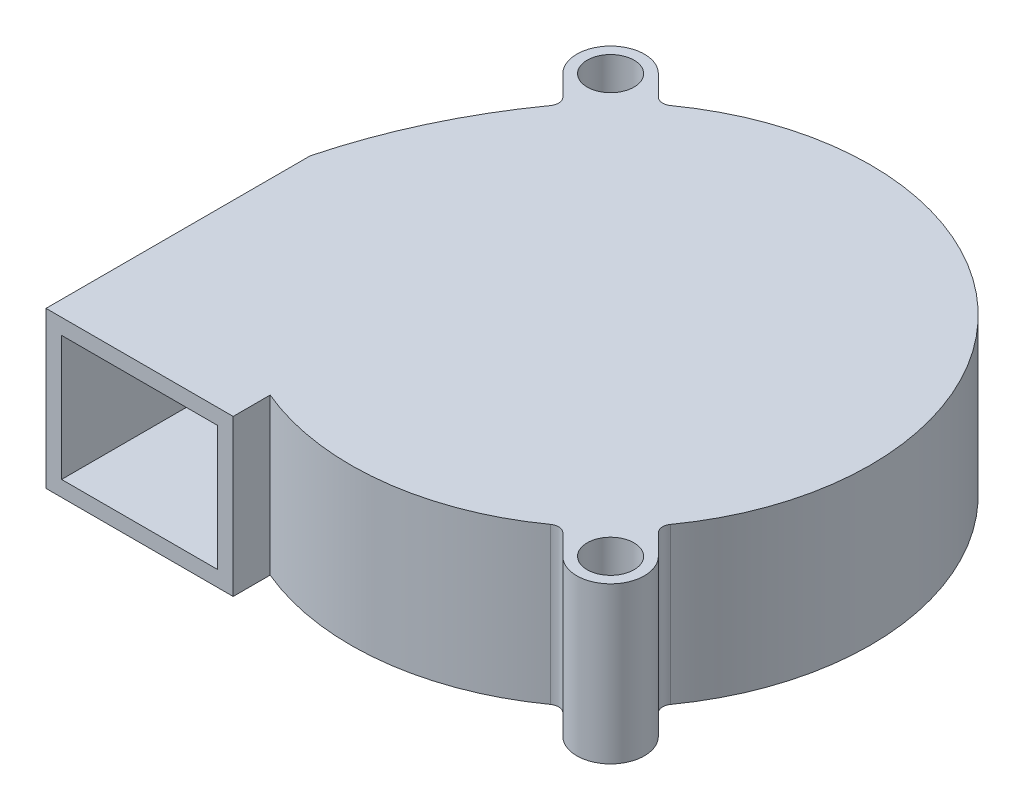
ISO-10303-21;
HEADER;
FILE_DESCRIPTION(('STEP AP214'),'2;1');
FILE_NAME('part.step','',(''),(''),'','','');
FILE_SCHEMA(('AUTOMOTIVE_DESIGN { 1 0 10303 214 1 1 1 1 }'));
ENDSEC;
DATA;
#1=APPLICATION_CONTEXT('core data for automotive mechanical design processes');
#2=APPLICATION_PROTOCOL_DEFINITION('international standard','automotive_design',2000,#1);
#3=PRODUCT_CONTEXT('',#1,'mechanical');
#4=PRODUCT('Part','Part','',(#3));
#5=PRODUCT_RELATED_PRODUCT_CATEGORY('part','',(#4));
#6=PRODUCT_DEFINITION_FORMATION('','',#4);
#7=PRODUCT_DEFINITION_CONTEXT('part definition',#1,'design');
#8=PRODUCT_DEFINITION('design','',#6,#7);
#9=PRODUCT_DEFINITION_SHAPE('','',#8);
#10=(LENGTH_UNIT() NAMED_UNIT(*) SI_UNIT(.MILLI.,.METRE.));
#11=(NAMED_UNIT(*) PLANE_ANGLE_UNIT() SI_UNIT($,.RADIAN.));
#12=(NAMED_UNIT(*) SI_UNIT($,.STERADIAN.) SOLID_ANGLE_UNIT());
#13=UNCERTAINTY_MEASURE_WITH_UNIT(LENGTH_MEASURE(1.E-05),#10,'distance_accuracy_value','');
#14=(GEOMETRIC_REPRESENTATION_CONTEXT(3) GLOBAL_UNCERTAINTY_ASSIGNED_CONTEXT((#13)) GLOBAL_UNIT_ASSIGNED_CONTEXT((#10,
#11,#12)) REPRESENTATION_CONTEXT('',''));
#15=CARTESIAN_POINT('',(0.,0.,0.));
#16=DIRECTION('',(0.,0.,1.));
#17=DIRECTION('',(1.,0.,0.));
#18=AXIS2_PLACEMENT_3D('',#15,#16,#17);
#19=CARTESIAN_POINT('',(0.,15.,26.6));
#20=DIRECTION('',(0.,0.,-1.));
#21=DIRECTION('',(-1.,0.,0.));
#22=AXIS2_PLACEMENT_3D('',#19,#20,#21);
#23=PLANE('',#22);
#24=DIRECTION('',(1.,0.,0.));
#25=VECTOR('',#24,1.);
#26=CARTESIAN_POINT('',(0.,0.,26.6));
#27=LINE('',#26,#25);
#28=CARTESIAN_POINT('',(-27.7,0.,26.6));
#29=VERTEX_POINT('',#28);
#30=CARTESIAN_POINT('',(-9.7,0.,26.6));
#31=VERTEX_POINT('',#30);
#32=EDGE_CURVE('E204',#29,#31,#27,.T.);
#33=ORIENTED_EDGE('',*,*,#32,.T.);
#34=DIRECTION('',(0.,-1.,0.));
#35=VECTOR('',#34,1.);
#36=CARTESIAN_POINT('',(-9.7,15.,26.6));
#37=LINE('',#36,#35);
#38=CARTESIAN_POINT('',(-9.7,15.,26.6));
#39=VERTEX_POINT('',#38);
#40=EDGE_CURVE('E269',#39,#31,#37,.T.);
#41=ORIENTED_EDGE('',*,*,#40,.F.);
#42=DIRECTION('',(1.,0.,0.));
#43=VECTOR('',#42,1.);
#44=CARTESIAN_POINT('',(0.,15.,26.6));
#45=LINE('',#44,#43);
#46=CARTESIAN_POINT('',(-27.7,15.,26.6));
#47=VERTEX_POINT('',#46);
#48=EDGE_CURVE('E276',#47,#39,#45,.T.);
#49=ORIENTED_EDGE('',*,*,#48,.F.);
#50=DIRECTION('',(0.,-1.,0.));
#51=VECTOR('',#50,1.);
#52=CARTESIAN_POINT('',(-27.7,15.,26.6));
#53=LINE('',#52,#51);
#54=EDGE_CURVE('E41',#47,#29,#53,.T.);
#55=ORIENTED_EDGE('',*,*,#54,.T.);
#56=EDGE_LOOP('',(#33,#41,#49,#55));
#57=FACE_BOUND('',#56,.T.);
#58=DIRECTION('',(1.,0.,0.));
#59=VECTOR('',#58,1.);
#60=CARTESIAN_POINT('',(0.,13.5,26.6));
#61=LINE('',#60,#59);
#62=CARTESIAN_POINT('',(-26.2,13.5,26.6));
#63=VERTEX_POINT('',#62);
#64=CARTESIAN_POINT('',(-11.2,13.5,26.6));
#65=VERTEX_POINT('',#64);
#66=EDGE_CURVE('E48',#63,#65,#61,.T.);
#67=ORIENTED_EDGE('',*,*,#66,.T.);
#68=DIRECTION('',(0.,1.,0.));
#69=VECTOR('',#68,1.);
#70=CARTESIAN_POINT('',(-11.2,0.,26.6));
#71=LINE('',#70,#69);
#72=CARTESIAN_POINT('',(-11.2,1.5,26.6));
#73=VERTEX_POINT('',#72);
#74=EDGE_CURVE('E420',#73,#65,#71,.T.);
#75=ORIENTED_EDGE('',*,*,#74,.F.);
#76=DIRECTION('',(1.,0.,0.));
#77=VECTOR('',#76,1.);
#78=CARTESIAN_POINT('',(0.,1.5,26.6));
#79=LINE('',#78,#77);
#80=CARTESIAN_POINT('',(-26.2,1.5,26.6));
#81=VERTEX_POINT('',#80);
#82=EDGE_CURVE('E425',#81,#73,#79,.T.);
#83=ORIENTED_EDGE('',*,*,#82,.F.);
#84=DIRECTION('',(0.,1.,0.));
#85=VECTOR('',#84,1.);
#86=CARTESIAN_POINT('',(-26.2,0.,26.6));
#87=LINE('',#86,#85);
#88=EDGE_CURVE('E432',#81,#63,#87,.T.);
#89=ORIENTED_EDGE('',*,*,#88,.T.);
#90=EDGE_LOOP('',(#67,#75,#83,#89));
#91=FACE_BOUND('',#90,.T.);
#92=ADVANCED_FACE('F33',(#57,#91),#23,.F.);
#93=CARTESIAN_POINT('',(18.4158798628568,15.,13.1806474858231));
#94=DIRECTION('',(0.,-1.,0.));
#95=DIRECTION('',(0.,0.,-1.));
#96=AXIS2_PLACEMENT_3D('',#93,#94,#95);
#97=CYLINDRICAL_SURFACE('',#96,47.6467238087258);
#98=CARTESIAN_POINT('',(18.4158798628568,0.,13.1806474858231));
#99=DIRECTION('',(0.,1.,0.));
#100=DIRECTION('',(0.,0.,1.));
#101=AXIS2_PLACEMENT_3D('',#98,#99,#100);
#102=CIRCLE('',#101,47.6467238087258);
#103=CARTESIAN_POINT('',(-20.3295187621809,0.,-14.5502806467139));
#104=VERTEX_POINT('',#103);
#105=CARTESIAN_POINT('',(-27.7,0.,1.2));
#106=VERTEX_POINT('',#105);
#107=EDGE_CURVE('E199',#104,#106,#102,.T.);
#108=ORIENTED_EDGE('',*,*,#107,.T.);
#109=DIRECTION('',(0.,-1.,0.));
#110=VECTOR('',#109,1.);
#111=CARTESIAN_POINT('',(-27.7,15.,1.2));
#112=LINE('',#111,#110);
#113=CARTESIAN_POINT('',(-27.7,15.,1.2));
#114=VERTEX_POINT('',#113);
#115=EDGE_CURVE('E11',#114,#106,#112,.T.);
#116=ORIENTED_EDGE('',*,*,#115,.F.);
#117=CARTESIAN_POINT('',(18.4158798628568,15.,13.1806474858231));
#118=DIRECTION('',(0.,1.,0.));
#119=DIRECTION('',(0.,0.,1.));
#120=AXIS2_PLACEMENT_3D('',#117,#118,#119);
#121=CIRCLE('',#120,47.6467238087258);
#122=CARTESIAN_POINT('',(-20.3295187621809,15.,-14.5502806467139));
#123=VERTEX_POINT('',#122);
#124=EDGE_CURVE('E244',#123,#114,#121,.T.);
#125=ORIENTED_EDGE('',*,*,#124,.F.);
#126=DIRECTION('',(0.,-1.,0.));
#127=VECTOR('',#126,1.);
#128=CARTESIAN_POINT('',(-20.3295187621809,15.,-14.5502806467139));
#129=LINE('',#128,#127);
#130=EDGE_CURVE('E57',#123,#104,#129,.T.);
#131=ORIENTED_EDGE('',*,*,#130,.T.);
#132=EDGE_LOOP('',(#108,#116,#125,#131));
#133=FACE_BOUND('',#132,.T.);
#134=ADVANCED_FACE('F35',(#133),#97,.T.);
#135=CARTESIAN_POINT('',(-27.7,15.,0.));
#136=DIRECTION('',(1.,0.,0.));
#137=DIRECTION('',(0.,0.,-1.));
#138=AXIS2_PLACEMENT_3D('',#135,#136,#137);
#139=PLANE('',#138);
#140=DIRECTION('',(0.,0.,1.));
#141=VECTOR('',#140,1.);
#142=CARTESIAN_POINT('',(-27.7,0.,0.));
#143=LINE('',#142,#141);
#144=EDGE_CURVE('E201',#106,#29,#143,.T.);
#145=ORIENTED_EDGE('',*,*,#144,.T.);
#146=ORIENTED_EDGE('',*,*,#54,.F.);
#147=DIRECTION('',(0.,0.,1.));
#148=VECTOR('',#147,1.);
#149=CARTESIAN_POINT('',(-27.7,15.,0.));
#150=LINE('',#149,#148);
#151=EDGE_CURVE('E120',#114,#47,#150,.T.);
#152=ORIENTED_EDGE('',*,*,#151,.F.);
#153=ORIENTED_EDGE('',*,*,#115,.T.);
#154=EDGE_LOOP('',(#145,#146,#152,#153));
#155=FACE_BOUND('',#154,.T.);
#156=ADVANCED_FACE('F328',(#155),#139,.F.);
#157=CARTESIAN_POINT('',(-9.7,15.,0.));
#158=DIRECTION('',(1.,0.,0.));
#159=DIRECTION('',(0.,0.,-1.));
#160=AXIS2_PLACEMENT_3D('',#157,#158,#159);
#161=PLANE('',#160);
#162=DIRECTION('',(0.,0.,1.));
#163=VECTOR('',#162,1.);
#164=CARTESIAN_POINT('',(-9.7,0.,0.));
#165=LINE('',#164,#163);
#166=CARTESIAN_POINT('',(-9.7,0.,23.0414843271869));
#167=VERTEX_POINT('',#166);
#168=EDGE_CURVE('E207',#167,#31,#165,.T.);
#169=ORIENTED_EDGE('',*,*,#168,.F.);
#170=DIRECTION('',(0.,-1.,0.));
#171=VECTOR('',#170,1.);
#172=CARTESIAN_POINT('',(-9.7,15.,23.0414843271869));
#173=LINE('',#172,#171);
#174=CARTESIAN_POINT('',(-9.7,15.,23.0414843271869));
#175=VERTEX_POINT('',#174);
#176=EDGE_CURVE('E267',#175,#167,#173,.T.);
#177=ORIENTED_EDGE('',*,*,#176,.F.);
#178=DIRECTION('',(0.,0.,1.));
#179=VECTOR('',#178,1.);
#180=CARTESIAN_POINT('',(-9.7,15.,0.));
#181=LINE('',#180,#179);
#182=EDGE_CURVE('E288',#175,#39,#181,.T.);
#183=ORIENTED_EDGE('',*,*,#182,.T.);
#184=ORIENTED_EDGE('',*,*,#40,.T.);
#185=EDGE_LOOP('',(#169,#177,#183,#184));
#186=FACE_BOUND('',#185,.T.);
#187=ADVANCED_FACE('F284',(#186),#161,.T.);
#188=CARTESIAN_POINT('',(0.,15.,0.));
#189=DIRECTION('',(0.,-1.,0.));
#190=DIRECTION('',(0.,0.,-1.));
#191=AXIS2_PLACEMENT_3D('',#188,#189,#190);
#192=CYLINDRICAL_SURFACE('',#191,25.);
#193=CARTESIAN_POINT('',(0.,0.,0.));
#194=DIRECTION('',(0.,1.,0.));
#195=DIRECTION('',(0.,0.,1.));
#196=AXIS2_PLACEMENT_3D('',#193,#194,#195);
#197=CIRCLE('',#196,25.);
#198=CARTESIAN_POINT('',(14.5502806467139,0.,20.3295187621809));
#199=VERTEX_POINT('',#198);
#200=EDGE_CURVE('E210',#167,#199,#197,.T.);
#201=ORIENTED_EDGE('',*,*,#200,.T.);
#202=DIRECTION('',(0.,-1.,0.));
#203=VECTOR('',#202,1.);
#204=CARTESIAN_POINT('',(14.5502806467139,15.,20.3295187621809));
#205=LINE('',#204,#203);
#206=CARTESIAN_POINT('',(14.5502806467139,15.,20.3295187621809));
#207=VERTEX_POINT('',#206);
#208=EDGE_CURVE('E264',#207,#199,#205,.T.);
#209=ORIENTED_EDGE('',*,*,#208,.F.);
#210=CARTESIAN_POINT('',(0.,15.,0.));
#211=DIRECTION('',(0.,1.,0.));
#212=DIRECTION('',(0.,0.,1.));
#213=AXIS2_PLACEMENT_3D('',#210,#211,#212);
#214=CIRCLE('',#213,25.);
#215=EDGE_CURVE('E289',#175,#207,#214,.T.);
#216=ORIENTED_EDGE('',*,*,#215,.F.);
#217=ORIENTED_EDGE('',*,*,#176,.T.);
#218=EDGE_LOOP('',(#201,#209,#216,#217));
#219=FACE_BOUND('',#218,.T.);
#220=ADVANCED_FACE('F334',(#219),#192,.T.);
#221=CARTESIAN_POINT('',(15.1322918725824,15.,21.1426995126681));
#222=DIRECTION('',(0.,-1.,0.));
#223=DIRECTION('',(0.,0.,-1.));
#224=AXIS2_PLACEMENT_3D('',#221,#222,#223);
#225=CYLINDRICAL_SURFACE('',#224,0.999999999999997);
#226=CARTESIAN_POINT('',(15.1322918725824,0.,21.1426995126681));
#227=DIRECTION('',(0.,1.,0.));
#228=DIRECTION('',(0.,0.,1.));
#229=AXIS2_PLACEMENT_3D('',#226,#227,#228);
#230=CIRCLE('',#229,0.999999999999997);
#231=CARTESIAN_POINT('',(15.839398653769,0.,20.4355927314815));
#232=VERTEX_POINT('',#231);
#233=EDGE_CURVE('E212',#199,#232,#230,.F.);
#234=ORIENTED_EDGE('',*,*,#233,.T.);
#235=DIRECTION('',(0.,-1.,0.));
#236=VECTOR('',#235,1.);
#237=CARTESIAN_POINT('',(15.839398653769,15.,20.4355927314815));
#238=LINE('',#237,#236);
#239=CARTESIAN_POINT('',(15.839398653769,15.,20.4355927314815));
#240=VERTEX_POINT('',#239);
#241=EDGE_CURVE('E262',#240,#232,#238,.T.);
#242=ORIENTED_EDGE('',*,*,#241,.F.);
#243=CARTESIAN_POINT('',(15.1322918725824,15.,21.1426995126681));
#244=DIRECTION('',(0.,1.,0.));
#245=DIRECTION('',(0.,0.,1.));
#246=AXIS2_PLACEMENT_3D('',#243,#244,#245);
#247=CIRCLE('',#246,0.999999999999997);
#248=EDGE_CURVE('E291',#207,#240,#247,.F.);
#249=ORIENTED_EDGE('',*,*,#248,.F.);
#250=ORIENTED_EDGE('',*,*,#208,.T.);
#251=EDGE_LOOP('',(#234,#242,#249,#250));
#252=FACE_BOUND('',#251,.T.);
#253=ADVANCED_FACE('F341',(#252),#225,.F.);
#254=CARTESIAN_POINT('',(-2.2980970388563,15.,2.29809703885631));
#255=DIRECTION('',(-0.707106781186546,0.,0.707106781186549));
#256=DIRECTION('',(0.707106781186549,0.,0.707106781186546));
#257=AXIS2_PLACEMENT_3D('',#254,#255,#256);
#258=PLANE('',#257);
#259=DIRECTION('',(-0.707106781186549,0.,-0.707106781186546));
#260=VECTOR('',#259,1.);
#261=CARTESIAN_POINT('',(-2.2980970388563,0.,2.29809703885631));
#262=LINE('',#261,#260);
#263=CARTESIAN_POINT('',(17.8019029611437,0.,22.3980970388563));
#264=VERTEX_POINT('',#263);
#265=EDGE_CURVE('E216',#264,#232,#262,.T.);
#266=ORIENTED_EDGE('',*,*,#265,.F.);
#267=DIRECTION('',(0.,-1.,0.));
#268=VECTOR('',#267,1.);
#269=CARTESIAN_POINT('',(17.8019029611437,15.,22.3980970388563));
#270=LINE('',#269,#268);
#271=CARTESIAN_POINT('',(17.8019029611437,15.,22.3980970388563));
#272=VERTEX_POINT('',#271);
#273=EDGE_CURVE('E260',#272,#264,#270,.T.);
#274=ORIENTED_EDGE('',*,*,#273,.F.);
#275=DIRECTION('',(-0.707106781186549,0.,-0.707106781186546));
#276=VECTOR('',#275,1.);
#277=CARTESIAN_POINT('',(-2.2980970388563,15.,2.29809703885631));
#278=LINE('',#277,#276);
#279=EDGE_CURVE('E298',#272,#240,#278,.T.);
#280=ORIENTED_EDGE('',*,*,#279,.T.);
#281=ORIENTED_EDGE('',*,*,#241,.T.);
#282=EDGE_LOOP('',(#266,#274,#280,#281));
#283=FACE_BOUND('',#282,.T.);
#284=ADVANCED_FACE('F344',(#283),#258,.T.);
#285=CARTESIAN_POINT('',(20.1,15.,20.1));
#286=DIRECTION('',(0.,-1.,0.));
#287=DIRECTION('',(0.,0.,-1.));
#288=AXIS2_PLACEMENT_3D('',#285,#286,#287);
#289=CYLINDRICAL_SURFACE('',#288,3.25);
#290=CARTESIAN_POINT('',(20.1,0.,20.1));
#291=DIRECTION('',(0.,1.,0.));
#292=DIRECTION('',(0.,0.,1.));
#293=AXIS2_PLACEMENT_3D('',#290,#291,#292);
#294=CIRCLE('',#293,3.25);
#295=CARTESIAN_POINT('',(22.3980970388563,0.,17.8019029611437));
#296=VERTEX_POINT('',#295);
#297=EDGE_CURVE('E219',#264,#296,#294,.T.);
#298=ORIENTED_EDGE('',*,*,#297,.T.);
#299=DIRECTION('',(0.,-1.,0.));
#300=VECTOR('',#299,1.);
#301=CARTESIAN_POINT('',(22.3980970388563,15.,17.8019029611437));
#302=LINE('',#301,#300);
#303=CARTESIAN_POINT('',(22.3980970388563,15.,17.8019029611437));
#304=VERTEX_POINT('',#303);
#305=EDGE_CURVE('E258',#304,#296,#302,.T.);
#306=ORIENTED_EDGE('',*,*,#305,.F.);
#307=CARTESIAN_POINT('',(20.1,15.,20.1));
#308=DIRECTION('',(0.,1.,0.));
#309=DIRECTION('',(0.,0.,1.));
#310=AXIS2_PLACEMENT_3D('',#307,#308,#309);
#311=CIRCLE('',#310,3.25);
#312=EDGE_CURVE('E301',#272,#304,#311,.T.);
#313=ORIENTED_EDGE('',*,*,#312,.F.);
#314=ORIENTED_EDGE('',*,*,#273,.T.);
#315=EDGE_LOOP('',(#298,#306,#313,#314));
#316=FACE_BOUND('',#315,.T.);
#317=ADVANCED_FACE('F348',(#316),#289,.T.);
#318=CARTESIAN_POINT('',(2.29809703885626,15.,-2.29809703885627));
#319=DIRECTION('',(0.707106781186547,0.,-0.707106781186548));
#320=DIRECTION('',(-0.707106781186548,0.,-0.707106781186547));
#321=AXIS2_PLACEMENT_3D('',#318,#319,#320);
#322=PLANE('',#321);
#323=DIRECTION('',(0.707106781186548,0.,0.707106781186547));
#324=VECTOR('',#323,1.);
#325=CARTESIAN_POINT('',(2.29809703885626,0.,-2.29809703885627));
#326=LINE('',#325,#324);
#327=CARTESIAN_POINT('',(20.4355927314815,0.,15.839398653769));
#328=VERTEX_POINT('',#327);
#329=EDGE_CURVE('E222',#328,#296,#326,.T.);
#330=ORIENTED_EDGE('',*,*,#329,.F.);
#331=DIRECTION('',(0.,-1.,0.));
#332=VECTOR('',#331,1.);
#333=CARTESIAN_POINT('',(20.4355927314815,15.,15.839398653769));
#334=LINE('',#333,#332);
#335=CARTESIAN_POINT('',(20.4355927314815,15.,15.839398653769));
#336=VERTEX_POINT('',#335);
#337=EDGE_CURVE('E256',#336,#328,#334,.T.);
#338=ORIENTED_EDGE('',*,*,#337,.F.);
#339=DIRECTION('',(0.707106781186548,0.,0.707106781186547));
#340=VECTOR('',#339,1.);
#341=CARTESIAN_POINT('',(2.29809703885626,15.,-2.29809703885627));
#342=LINE('',#341,#340);
#343=EDGE_CURVE('E303',#336,#304,#342,.T.);
#344=ORIENTED_EDGE('',*,*,#343,.T.);
#345=ORIENTED_EDGE('',*,*,#305,.T.);
#346=EDGE_LOOP('',(#330,#338,#344,#345));
#347=FACE_BOUND('',#346,.T.);
#348=ADVANCED_FACE('F352',(#347),#322,.T.);
#349=CARTESIAN_POINT('',(21.1426995126681,15.,15.1322918725824));
#350=DIRECTION('',(0.,-1.,0.));
#351=DIRECTION('',(0.,0.,-1.));
#352=AXIS2_PLACEMENT_3D('',#349,#350,#351);
#353=CYLINDRICAL_SURFACE('',#352,0.999999999999997);
#354=CARTESIAN_POINT('',(21.1426995126681,0.,15.1322918725824));
#355=DIRECTION('',(0.,1.,0.));
#356=DIRECTION('',(0.,0.,1.));
#357=AXIS2_PLACEMENT_3D('',#354,#355,#356);
#358=CIRCLE('',#357,0.999999999999997);
#359=CARTESIAN_POINT('',(20.3295187621809,0.,14.5502806467139));
#360=VERTEX_POINT('',#359);
#361=EDGE_CURVE('E225',#360,#328,#358,.T.);
#362=ORIENTED_EDGE('',*,*,#361,.F.);
#363=DIRECTION('',(0.,-1.,0.));
#364=VECTOR('',#363,1.);
#365=CARTESIAN_POINT('',(20.3295187621809,15.,14.5502806467139));
#366=LINE('',#365,#364);
#367=CARTESIAN_POINT('',(20.3295187621809,15.,14.5502806467139));
#368=VERTEX_POINT('',#367);
#369=EDGE_CURVE('E254',#368,#360,#366,.T.);
#370=ORIENTED_EDGE('',*,*,#369,.F.);
#371=CARTESIAN_POINT('',(21.1426995126681,15.,15.1322918725824));
#372=DIRECTION('',(0.,1.,0.));
#373=DIRECTION('',(0.,0.,1.));
#374=AXIS2_PLACEMENT_3D('',#371,#372,#373);
#375=CIRCLE('',#374,0.999999999999997);
#376=EDGE_CURVE('E306',#368,#336,#375,.T.);
#377=ORIENTED_EDGE('',*,*,#376,.T.);
#378=ORIENTED_EDGE('',*,*,#337,.T.);
#379=EDGE_LOOP('',(#362,#370,#377,#378));
#380=FACE_BOUND('',#379,.T.);
#381=ADVANCED_FACE('F356',(#380),#353,.F.);
#382=CARTESIAN_POINT('',(-14.5502806467139,0.,-20.3295187621809));
#383=VERTEX_POINT('',#382);
#384=EDGE_CURVE('E213',#360,#383,#197,.T.);
#385=ORIENTED_EDGE('',*,*,#384,.T.);
#386=DIRECTION('',(0.,-1.,0.));
#387=VECTOR('',#386,1.);
#388=CARTESIAN_POINT('',(-14.5502806467139,15.,-20.3295187621809));
#389=LINE('',#388,#387);
#390=CARTESIAN_POINT('',(-14.5502806467139,15.,-20.3295187621809));
#391=VERTEX_POINT('',#390);
#392=EDGE_CURVE('E251',#391,#383,#389,.T.);
#393=ORIENTED_EDGE('',*,*,#392,.F.);
#394=EDGE_CURVE('E293',#368,#391,#214,.T.);
#395=ORIENTED_EDGE('',*,*,#394,.F.);
#396=ORIENTED_EDGE('',*,*,#369,.T.);
#397=EDGE_LOOP('',(#385,#393,#395,#396));
#398=FACE_BOUND('',#397,.T.);
#399=ADVANCED_FACE('F317',(#398),#192,.T.);
#400=CARTESIAN_POINT('',(-15.1322918725824,15.,-21.1426995126681));
#401=DIRECTION('',(0.,-1.,0.));
#402=DIRECTION('',(0.,0.,-1.));
#403=AXIS2_PLACEMENT_3D('',#400,#401,#402);
#404=CYLINDRICAL_SURFACE('',#403,0.999999999999997);
#405=CARTESIAN_POINT('',(-15.1322918725824,0.,-21.1426995126681));
#406=DIRECTION('',(0.,1.,0.));
#407=DIRECTION('',(0.,0.,1.));
#408=AXIS2_PLACEMENT_3D('',#405,#406,#407);
#409=CIRCLE('',#408,0.999999999999997);
#410=CARTESIAN_POINT('',(-15.839398653769,0.,-20.4355927314815));
#411=VERTEX_POINT('',#410);
#412=EDGE_CURVE('E228',#383,#411,#409,.F.);
#413=ORIENTED_EDGE('',*,*,#412,.T.);
#414=DIRECTION('',(0.,-1.,0.));
#415=VECTOR('',#414,1.);
#416=CARTESIAN_POINT('',(-15.839398653769,15.,-20.4355927314815));
#417=LINE('',#416,#415);
#418=CARTESIAN_POINT('',(-15.839398653769,15.,-20.4355927314815));
#419=VERTEX_POINT('',#418);
#420=EDGE_CURVE('E248',#419,#411,#417,.T.);
#421=ORIENTED_EDGE('',*,*,#420,.F.);
#422=CARTESIAN_POINT('',(-15.1322918725824,15.,-21.1426995126681));
#423=DIRECTION('',(0.,1.,0.));
#424=DIRECTION('',(0.,0.,1.));
#425=AXIS2_PLACEMENT_3D('',#422,#423,#424);
#426=CIRCLE('',#425,0.999999999999997);
#427=EDGE_CURVE('E309',#391,#419,#426,.F.);
#428=ORIENTED_EDGE('',*,*,#427,.F.);
#429=ORIENTED_EDGE('',*,*,#392,.T.);
#430=EDGE_LOOP('',(#413,#421,#428,#429));
#431=FACE_BOUND('',#430,.T.);
#432=ADVANCED_FACE('F321',(#431),#404,.F.);
#433=CARTESIAN_POINT('',(2.29809703885625,15.,-2.29809703885624));
#434=DIRECTION('',(-0.707106781186549,0.,0.707106781186546));
#435=DIRECTION('',(0.707106781186546,0.,0.707106781186549));
#436=AXIS2_PLACEMENT_3D('',#433,#434,#435);
#437=PLANE('',#436);
#438=DIRECTION('',(-0.707106781186546,0.,-0.707106781186549));
#439=VECTOR('',#438,1.);
#440=CARTESIAN_POINT('',(2.29809703885625,0.,-2.29809703885624));
#441=LINE('',#440,#439);
#442=CARTESIAN_POINT('',(-17.8019029611437,0.,-22.3980970388563));
#443=VERTEX_POINT('',#442);
#444=EDGE_CURVE('E230',#411,#443,#441,.T.);
#445=ORIENTED_EDGE('',*,*,#444,.T.);
#446=DIRECTION('',(0.,-1.,0.));
#447=VECTOR('',#446,1.);
#448=CARTESIAN_POINT('',(-17.8019029611437,15.,-22.3980970388563));
#449=LINE('',#448,#447);
#450=CARTESIAN_POINT('',(-17.8019029611437,15.,-22.3980970388563));
#451=VERTEX_POINT('',#450);
#452=EDGE_CURVE('E184',#451,#443,#449,.T.);
#453=ORIENTED_EDGE('',*,*,#452,.F.);
#454=DIRECTION('',(-0.707106781186546,0.,-0.707106781186549));
#455=VECTOR('',#454,1.);
#456=CARTESIAN_POINT('',(2.29809703885625,15.,-2.29809703885624));
#457=LINE('',#456,#455);
#458=EDGE_CURVE('E171',#419,#451,#457,.T.);
#459=ORIENTED_EDGE('',*,*,#458,.F.);
#460=ORIENTED_EDGE('',*,*,#420,.T.);
#461=EDGE_LOOP('',(#445,#453,#459,#460));
#462=FACE_BOUND('',#461,.T.);
#463=ADVANCED_FACE('F324',(#462),#437,.F.);
#464=CARTESIAN_POINT('',(-20.1,15.,-20.1));
#465=DIRECTION('',(0.,-1.,0.));
#466=DIRECTION('',(0.,0.,-1.));
#467=AXIS2_PLACEMENT_3D('',#464,#465,#466);
#468=CYLINDRICAL_SURFACE('',#467,3.25);
#469=CARTESIAN_POINT('',(-20.1,0.,-20.1));
#470=DIRECTION('',(0.,1.,0.));
#471=DIRECTION('',(0.,0.,1.));
#472=AXIS2_PLACEMENT_3D('',#469,#470,#471);
#473=CIRCLE('',#472,3.25);
#474=CARTESIAN_POINT('',(-22.3980970388563,0.,-17.8019029611437));
#475=VERTEX_POINT('',#474);
#476=EDGE_CURVE('E180',#443,#475,#473,.T.);
#477=ORIENTED_EDGE('',*,*,#476,.T.);
#478=DIRECTION('',(0.,-1.,0.));
#479=VECTOR('',#478,1.);
#480=CARTESIAN_POINT('',(-22.3980970388563,15.,-17.8019029611437));
#481=LINE('',#480,#479);
#482=CARTESIAN_POINT('',(-22.3980970388563,15.,-17.8019029611437));
#483=VERTEX_POINT('',#482);
#484=EDGE_CURVE('E177',#483,#475,#481,.T.);
#485=ORIENTED_EDGE('',*,*,#484,.F.);
#486=CARTESIAN_POINT('',(-20.1,15.,-20.1));
#487=DIRECTION('',(0.,1.,0.));
#488=DIRECTION('',(0.,0.,1.));
#489=AXIS2_PLACEMENT_3D('',#486,#487,#488);
#490=CIRCLE('',#489,3.25);
#491=EDGE_CURVE('E163',#451,#483,#490,.T.);
#492=ORIENTED_EDGE('',*,*,#491,.F.);
#493=ORIENTED_EDGE('',*,*,#452,.T.);
#494=EDGE_LOOP('',(#477,#485,#492,#493));
#495=FACE_BOUND('',#494,.T.);
#496=ADVANCED_FACE('F178',(#495),#468,.T.);
#497=CARTESIAN_POINT('',(-2.29809703885626,15.,2.29809703885627));
#498=DIRECTION('',(-0.707106781186547,0.,0.707106781186548));
#499=DIRECTION('',(0.707106781186548,0.,0.707106781186547));
#500=AXIS2_PLACEMENT_3D('',#497,#498,#499);
#501=PLANE('',#500);
#502=DIRECTION('',(-0.707106781186548,0.,-0.707106781186547));
#503=VECTOR('',#502,1.);
#504=CARTESIAN_POINT('',(-2.29809703885626,0.,2.29809703885627));
#505=LINE('',#504,#503);
#506=CARTESIAN_POINT('',(-20.4355927314815,0.,-15.839398653769));
#507=VERTEX_POINT('',#506);
#508=EDGE_CURVE('E233',#507,#475,#505,.T.);
#509=ORIENTED_EDGE('',*,*,#508,.F.);
#510=DIRECTION('',(0.,-1.,0.));
#511=VECTOR('',#510,1.);
#512=CARTESIAN_POINT('',(-20.4355927314815,15.,-15.839398653769));
#513=LINE('',#512,#511);
#514=CARTESIAN_POINT('',(-20.4355927314815,15.,-15.839398653769));
#515=VERTEX_POINT('',#514);
#516=EDGE_CURVE('E185',#515,#507,#513,.T.);
#517=ORIENTED_EDGE('',*,*,#516,.F.);
#518=DIRECTION('',(-0.707106781186548,0.,-0.707106781186547));
#519=VECTOR('',#518,1.);
#520=CARTESIAN_POINT('',(-2.29809703885626,15.,2.29809703885627));
#521=LINE('',#520,#519);
#522=EDGE_CURVE('E169',#515,#483,#521,.T.);
#523=ORIENTED_EDGE('',*,*,#522,.T.);
#524=ORIENTED_EDGE('',*,*,#484,.T.);
#525=EDGE_LOOP('',(#509,#517,#523,#524));
#526=FACE_BOUND('',#525,.T.);
#527=ADVANCED_FACE('F187',(#526),#501,.T.);
#528=CARTESIAN_POINT('',(-20.1,15.,-20.1));
#529=DIRECTION('',(0.,-1.,0.));
#530=DIRECTION('',(0.,0.,-1.));
#531=AXIS2_PLACEMENT_3D('',#528,#529,#530);
#532=CYLINDRICAL_SURFACE('',#531,2.25);
#533=CARTESIAN_POINT('',(-20.1,15.,-20.1));
#534=DIRECTION('',(0.,1.,0.));
#535=DIRECTION('',(0.,0.,1.));
#536=AXIS2_PLACEMENT_3D('',#533,#534,#535);
#537=CIRCLE('',#536,2.25);
#538=CARTESIAN_POINT('',(-20.1,15.,-17.85));
#539=VERTEX_POINT('',#538);
#540=EDGE_CURVE('E190',#539,#539,#537,.T.);
#541=ORIENTED_EDGE('',*,*,#540,.T.);
#542=EDGE_LOOP('',(#541));
#543=FACE_BOUND('',#542,.T.);
#544=CARTESIAN_POINT('',(-20.1,0.,-20.1));
#545=DIRECTION('',(0.,1.,0.));
#546=DIRECTION('',(0.,0.,1.));
#547=AXIS2_PLACEMENT_3D('',#544,#545,#546);
#548=CIRCLE('',#547,2.25);
#549=CARTESIAN_POINT('',(-20.1,0.,-17.85));
#550=VERTEX_POINT('',#549);
#551=EDGE_CURVE('E238',#550,#550,#548,.T.);
#552=ORIENTED_EDGE('',*,*,#551,.F.);
#553=EDGE_LOOP('',(#552));
#554=FACE_BOUND('',#553,.T.);
#555=ADVANCED_FACE('F371',(#543,#554),#532,.F.);
#556=CARTESIAN_POINT('',(-21.1426995126681,15.,-15.1322918725824));
#557=DIRECTION('',(0.,-1.,0.));
#558=DIRECTION('',(0.,0.,-1.));
#559=AXIS2_PLACEMENT_3D('',#556,#557,#558);
#560=CYLINDRICAL_SURFACE('',#559,1.);
#561=CARTESIAN_POINT('',(-21.1426995126681,0.,-15.1322918725824));
#562=DIRECTION('',(0.,1.,0.));
#563=DIRECTION('',(0.,0.,1.));
#564=AXIS2_PLACEMENT_3D('',#561,#562,#563);
#565=CIRCLE('',#564,1.);
#566=EDGE_CURVE('E235',#104,#507,#565,.T.);
#567=ORIENTED_EDGE('',*,*,#566,.F.);
#568=ORIENTED_EDGE('',*,*,#130,.F.);
#569=CARTESIAN_POINT('',(-21.1426995126681,15.,-15.1322918725824));
#570=DIRECTION('',(0.,1.,0.));
#571=DIRECTION('',(0.,0.,1.));
#572=AXIS2_PLACEMENT_3D('',#569,#570,#571);
#573=CIRCLE('',#572,1.);
#574=EDGE_CURVE('E188',#123,#515,#573,.T.);
#575=ORIENTED_EDGE('',*,*,#574,.T.);
#576=ORIENTED_EDGE('',*,*,#516,.T.);
#577=EDGE_LOOP('',(#567,#568,#575,#576));
#578=FACE_BOUND('',#577,.T.);
#579=ADVANCED_FACE('F325',(#578),#560,.F.);
#580=CARTESIAN_POINT('',(20.1,15.,20.1));
#581=DIRECTION('',(0.,-1.,0.));
#582=DIRECTION('',(0.,0.,-1.));
#583=AXIS2_PLACEMENT_3D('',#580,#581,#582);
#584=CYLINDRICAL_SURFACE('',#583,2.25);
#585=CARTESIAN_POINT('',(20.1,15.,20.1));
#586=DIRECTION('',(0.,1.,0.));
#587=DIRECTION('',(0.,0.,1.));
#588=AXIS2_PLACEMENT_3D('',#585,#586,#587);
#589=CIRCLE('',#588,2.25);
#590=CARTESIAN_POINT('',(20.1,15.,22.35));
#591=VERTEX_POINT('',#590);
#592=EDGE_CURVE('E196',#591,#591,#589,.T.);
#593=ORIENTED_EDGE('',*,*,#592,.T.);
#594=EDGE_LOOP('',(#593));
#595=FACE_BOUND('',#594,.T.);
#596=CARTESIAN_POINT('',(20.1,0.,20.1));
#597=DIRECTION('',(0.,1.,0.));
#598=DIRECTION('',(0.,0.,1.));
#599=AXIS2_PLACEMENT_3D('',#596,#597,#598);
#600=CIRCLE('',#599,2.25);
#601=CARTESIAN_POINT('',(20.1,0.,22.35));
#602=VERTEX_POINT('',#601);
#603=EDGE_CURVE('E241',#602,#602,#600,.T.);
#604=ORIENTED_EDGE('',*,*,#603,.F.);
#605=EDGE_LOOP('',(#604));
#606=FACE_BOUND('',#605,.T.);
#607=ADVANCED_FACE('F374',(#595,#606),#584,.F.);
#608=CARTESIAN_POINT('',(0.,15.,0.));
#609=DIRECTION('',(0.,1.,0.));
#610=DIRECTION('',(0.,0.,1.));
#611=AXIS2_PLACEMENT_3D('',#608,#609,#610);
#612=PLANE('',#611);
#613=ORIENTED_EDGE('',*,*,#124,.T.);
#614=ORIENTED_EDGE('',*,*,#151,.T.);
#615=ORIENTED_EDGE('',*,*,#48,.T.);
#616=ORIENTED_EDGE('',*,*,#182,.F.);
#617=ORIENTED_EDGE('',*,*,#215,.T.);
#618=ORIENTED_EDGE('',*,*,#248,.T.);
#619=ORIENTED_EDGE('',*,*,#279,.F.);
#620=ORIENTED_EDGE('',*,*,#312,.T.);
#621=ORIENTED_EDGE('',*,*,#343,.F.);
#622=ORIENTED_EDGE('',*,*,#376,.F.);
#623=ORIENTED_EDGE('',*,*,#394,.T.);
#624=ORIENTED_EDGE('',*,*,#427,.T.);
#625=ORIENTED_EDGE('',*,*,#458,.T.);
#626=ORIENTED_EDGE('',*,*,#491,.T.);
#627=ORIENTED_EDGE('',*,*,#522,.F.);
#628=ORIENTED_EDGE('',*,*,#574,.F.);
#629=EDGE_LOOP('',(#613,#614,#615,#616,#617,#618,#619,#620,#621,#622,#623,#624,#625,#626,#627,#628));
#630=FACE_BOUND('',#629,.T.);
#631=ORIENTED_EDGE('',*,*,#540,.F.);
#632=EDGE_LOOP('',(#631));
#633=FACE_BOUND('',#632,.T.);
#634=ORIENTED_EDGE('',*,*,#592,.F.);
#635=EDGE_LOOP('',(#634));
#636=FACE_BOUND('',#635,.T.);
#637=ADVANCED_FACE('F165',(#630,#633,#636),#612,.T.);
#638=CARTESIAN_POINT('',(0.,0.,0.));
#639=DIRECTION('',(0.,1.,0.));
#640=DIRECTION('',(0.,0.,1.));
#641=AXIS2_PLACEMENT_3D('',#638,#639,#640);
#642=PLANE('',#641);
#643=ORIENTED_EDGE('',*,*,#107,.F.);
#644=ORIENTED_EDGE('',*,*,#566,.T.);
#645=ORIENTED_EDGE('',*,*,#508,.T.);
#646=ORIENTED_EDGE('',*,*,#476,.F.);
#647=ORIENTED_EDGE('',*,*,#444,.F.);
#648=ORIENTED_EDGE('',*,*,#412,.F.);
#649=ORIENTED_EDGE('',*,*,#384,.F.);
#650=ORIENTED_EDGE('',*,*,#361,.T.);
#651=ORIENTED_EDGE('',*,*,#329,.T.);
#652=ORIENTED_EDGE('',*,*,#297,.F.);
#653=ORIENTED_EDGE('',*,*,#265,.T.);
#654=ORIENTED_EDGE('',*,*,#233,.F.);
#655=ORIENTED_EDGE('',*,*,#200,.F.);
#656=ORIENTED_EDGE('',*,*,#168,.T.);
#657=ORIENTED_EDGE('',*,*,#32,.F.);
#658=ORIENTED_EDGE('',*,*,#144,.F.);
#659=EDGE_LOOP('',(#643,#644,#645,#646,#647,#648,#649,#650,#651,#652,#653,#654,#655,#656,#657,#658));
#660=FACE_BOUND('',#659,.T.);
#661=ORIENTED_EDGE('',*,*,#551,.T.);
#662=EDGE_LOOP('',(#661));
#663=FACE_BOUND('',#662,.T.);
#664=ORIENTED_EDGE('',*,*,#603,.T.);
#665=EDGE_LOOP('',(#664));
#666=FACE_BOUND('',#665,.T.);
#667=ADVANCED_FACE('F278',(#660,#663,#666),#642,.F.);
#668=CARTESIAN_POINT('',(0.,13.5,6.6));
#669=DIRECTION('',(0.,-1.,0.));
#670=DIRECTION('',(0.,0.,-1.));
#671=AXIS2_PLACEMENT_3D('',#668,#669,#670);
#672=PLANE('',#671);
#673=ORIENTED_EDGE('',*,*,#66,.F.);
#674=DIRECTION('',(0.,0.,1.));
#675=VECTOR('',#674,1.);
#676=CARTESIAN_POINT('',(-26.2,13.5,6.6));
#677=LINE('',#676,#675);
#678=CARTESIAN_POINT('',(-26.2,13.5,6.6));
#679=VERTEX_POINT('',#678);
#680=EDGE_CURVE('E430',#679,#63,#677,.T.);
#681=ORIENTED_EDGE('',*,*,#680,.F.);
#682=DIRECTION('',(1.,0.,0.));
#683=VECTOR('',#682,1.);
#684=CARTESIAN_POINT('',(0.,13.5,6.6));
#685=LINE('',#684,#683);
#686=CARTESIAN_POINT('',(-11.2,13.5,6.6));
#687=VERTEX_POINT('',#686);
#688=EDGE_CURVE('E410',#679,#687,#685,.T.);
#689=ORIENTED_EDGE('',*,*,#688,.T.);
#690=DIRECTION('',(0.,0.,1.));
#691=VECTOR('',#690,1.);
#692=CARTESIAN_POINT('',(-11.2,13.5,6.6));
#693=LINE('',#692,#691);
#694=EDGE_CURVE('E202',#687,#65,#693,.T.);
#695=ORIENTED_EDGE('',*,*,#694,.T.);
#696=EDGE_LOOP('',(#673,#681,#689,#695));
#697=FACE_BOUND('',#696,.T.);
#698=ADVANCED_FACE('F383',(#697),#672,.T.);
#699=CARTESIAN_POINT('',(-11.2,0.,6.6));
#700=DIRECTION('',(1.,0.,0.));
#701=DIRECTION('',(0.,0.,-1.));
#702=AXIS2_PLACEMENT_3D('',#699,#700,#701);
#703=PLANE('',#702);
#704=ORIENTED_EDGE('',*,*,#74,.T.);
#705=ORIENTED_EDGE('',*,*,#694,.F.);
#706=DIRECTION('',(0.,1.,0.));
#707=VECTOR('',#706,1.);
#708=CARTESIAN_POINT('',(-11.2,0.,6.6));
#709=LINE('',#708,#707);
#710=CARTESIAN_POINT('',(-11.2,1.5,6.6));
#711=VERTEX_POINT('',#710);
#712=EDGE_CURVE('E417',#711,#687,#709,.T.);
#713=ORIENTED_EDGE('',*,*,#712,.F.);
#714=DIRECTION('',(0.,0.,1.));
#715=VECTOR('',#714,1.);
#716=CARTESIAN_POINT('',(-11.2,1.5,6.6));
#717=LINE('',#716,#715);
#718=EDGE_CURVE('E438',#711,#73,#717,.T.);
#719=ORIENTED_EDGE('',*,*,#718,.T.);
#720=EDGE_LOOP('',(#704,#705,#713,#719));
#721=FACE_BOUND('',#720,.T.);
#722=ADVANCED_FACE('F388',(#721),#703,.F.);
#723=CARTESIAN_POINT('',(0.,1.5,6.6));
#724=DIRECTION('',(0.,-1.,0.));
#725=DIRECTION('',(0.,0.,-1.));
#726=AXIS2_PLACEMENT_3D('',#723,#724,#725);
#727=PLANE('',#726);
#728=ORIENTED_EDGE('',*,*,#82,.T.);
#729=ORIENTED_EDGE('',*,*,#718,.F.);
#730=DIRECTION('',(1.,0.,0.));
#731=VECTOR('',#730,1.);
#732=CARTESIAN_POINT('',(0.,1.5,6.6));
#733=LINE('',#732,#731);
#734=CARTESIAN_POINT('',(-26.2,1.5,6.6));
#735=VERTEX_POINT('',#734);
#736=EDGE_CURVE('E422',#735,#711,#733,.T.);
#737=ORIENTED_EDGE('',*,*,#736,.F.);
#738=DIRECTION('',(0.,0.,1.));
#739=VECTOR('',#738,1.);
#740=CARTESIAN_POINT('',(-26.2,1.5,6.6));
#741=LINE('',#740,#739);
#742=EDGE_CURVE('E441',#735,#81,#741,.T.);
#743=ORIENTED_EDGE('',*,*,#742,.T.);
#744=EDGE_LOOP('',(#728,#729,#737,#743));
#745=FACE_BOUND('',#744,.T.);
#746=ADVANCED_FACE('F393',(#745),#727,.F.);
#747=CARTESIAN_POINT('',(-26.2,0.,6.6));
#748=DIRECTION('',(1.,0.,0.));
#749=DIRECTION('',(0.,0.,-1.));
#750=AXIS2_PLACEMENT_3D('',#747,#748,#749);
#751=PLANE('',#750);
#752=ORIENTED_EDGE('',*,*,#88,.F.);
#753=ORIENTED_EDGE('',*,*,#742,.F.);
#754=DIRECTION('',(0.,1.,0.));
#755=VECTOR('',#754,1.);
#756=CARTESIAN_POINT('',(-26.2,0.,6.6));
#757=LINE('',#756,#755);
#758=EDGE_CURVE('E414',#735,#679,#757,.T.);
#759=ORIENTED_EDGE('',*,*,#758,.T.);
#760=ORIENTED_EDGE('',*,*,#680,.T.);
#761=EDGE_LOOP('',(#752,#753,#759,#760));
#762=FACE_BOUND('',#761,.T.);
#763=ADVANCED_FACE('F389',(#762),#751,.T.);
#764=CARTESIAN_POINT('',(0.,0.,6.6));
#765=DIRECTION('',(0.,0.,1.));
#766=DIRECTION('',(1.,0.,0.));
#767=AXIS2_PLACEMENT_3D('',#764,#765,#766);
#768=PLANE('',#767);
#769=ORIENTED_EDGE('',*,*,#688,.F.);
#770=ORIENTED_EDGE('',*,*,#758,.F.);
#771=ORIENTED_EDGE('',*,*,#736,.T.);
#772=ORIENTED_EDGE('',*,*,#712,.T.);
#773=EDGE_LOOP('',(#769,#770,#771,#772));
#774=FACE_BOUND('',#773,.T.);
#775=ADVANCED_FACE('F392',(#774),#768,.T.);
#776=CLOSED_SHELL('',(#92,#134,#156,#187,#220,#253,#284,#317,#348,#381,#399,#432,#463,#496,#527,
#555,#579,#607,#637,#667,#698,#722,#746,#763,#775));
#777=MANIFOLD_SOLID_BREP('B2',#776);
#778=ADVANCED_BREP_SHAPE_REPRESENTATION('',(#18,#777),#14);
#779=SHAPE_DEFINITION_REPRESENTATION(#9,#778);
ENDSEC;
END-ISO-10303-21;
